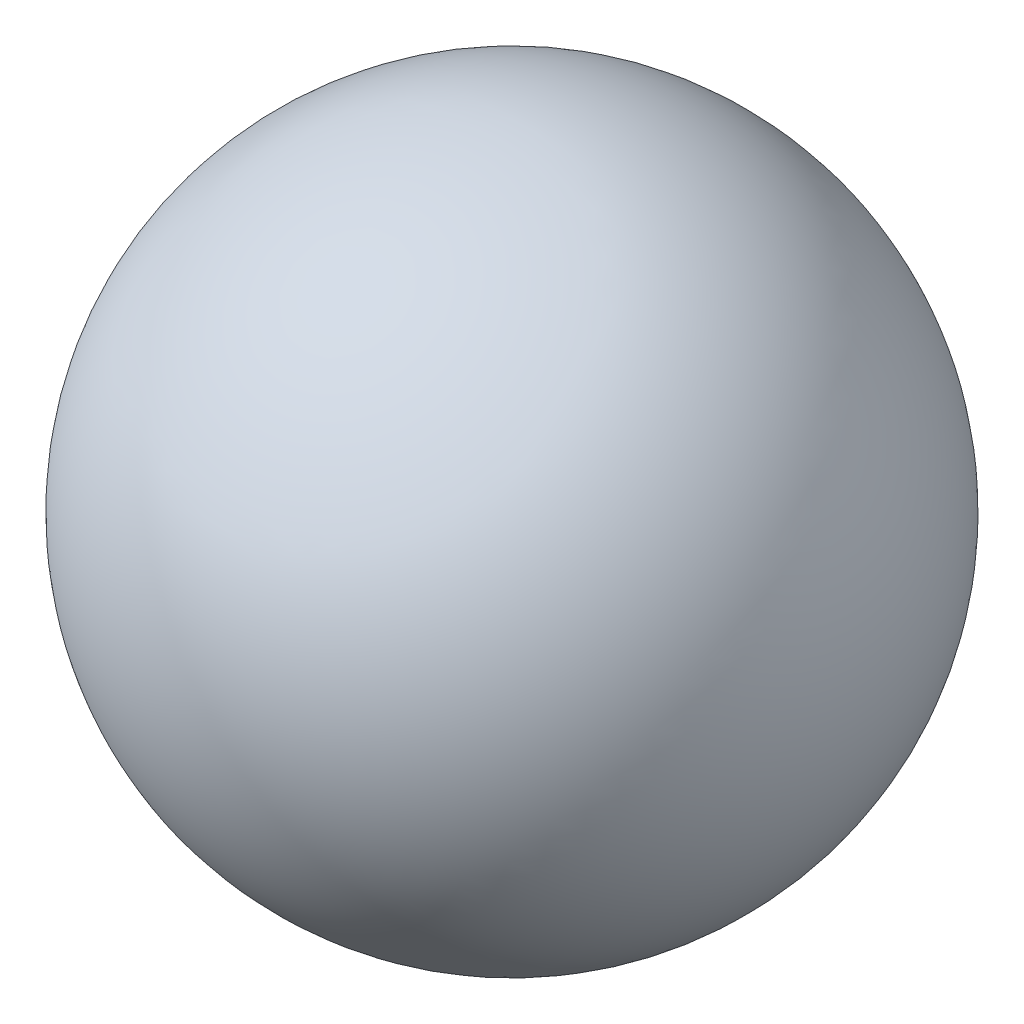
ISO-10303-21;
HEADER;
FILE_DESCRIPTION(('STEP AP214'),'2;1');
FILE_NAME('part.step','',(''),(''),'','','');
FILE_SCHEMA(('AUTOMOTIVE_DESIGN { 1 0 10303 214 1 1 1 1 }'));
ENDSEC;
DATA;
#1=APPLICATION_CONTEXT('core data for automotive mechanical design processes');
#2=APPLICATION_PROTOCOL_DEFINITION('international standard','automotive_design',2000,#1);
#3=PRODUCT_CONTEXT('',#1,'mechanical');
#4=PRODUCT('Part','Part','',(#3));
#5=PRODUCT_RELATED_PRODUCT_CATEGORY('part','',(#4));
#6=PRODUCT_DEFINITION_FORMATION('','',#4);
#7=PRODUCT_DEFINITION_CONTEXT('part definition',#1,'design');
#8=PRODUCT_DEFINITION('design','',#6,#7);
#9=PRODUCT_DEFINITION_SHAPE('','',#8);
#10=(LENGTH_UNIT() NAMED_UNIT(*) SI_UNIT(.MILLI.,.METRE.));
#11=(NAMED_UNIT(*) PLANE_ANGLE_UNIT() SI_UNIT($,.RADIAN.));
#12=(NAMED_UNIT(*) SI_UNIT($,.STERADIAN.) SOLID_ANGLE_UNIT());
#13=UNCERTAINTY_MEASURE_WITH_UNIT(LENGTH_MEASURE(1.E-05),#10,'distance_accuracy_value','');
#14=(GEOMETRIC_REPRESENTATION_CONTEXT(3) GLOBAL_UNCERTAINTY_ASSIGNED_CONTEXT((#13)) GLOBAL_UNIT_ASSIGNED_CONTEXT((#10,
#11,#12)) REPRESENTATION_CONTEXT('',''));
#15=CARTESIAN_POINT('',(0.,0.,0.));
#16=DIRECTION('',(0.,0.,1.));
#17=DIRECTION('',(1.,0.,0.));
#18=AXIS2_PLACEMENT_3D('',#15,#16,#17);
#19=CARTESIAN_POINT('',(0.,0.,0.));
#20=DIRECTION('',(0.,0.,-1.));
#21=DIRECTION('',(1.,0.,0.));
#22=AXIS2_PLACEMENT_3D('',#19,#20,#21);
#23=SPHERICAL_SURFACE('',#22,11.43);
#24=CARTESIAN_POINT('',(0.,0.,-11.43));
#25=VERTEX_POINT('',#24);
#26=VERTEX_LOOP('',#25);
#27=FACE_BOUND('',#26,.T.);
#28=ADVANCED_FACE('F29',(#27),#23,.T.);
#29=CLOSED_SHELL('',(#28));
#30=MANIFOLD_SOLID_BREP('B2',#29);
#31=ADVANCED_BREP_SHAPE_REPRESENTATION('',(#18,#30),#14);
#32=SHAPE_DEFINITION_REPRESENTATION(#9,#31);
ENDSEC;
END-ISO-10303-21;
